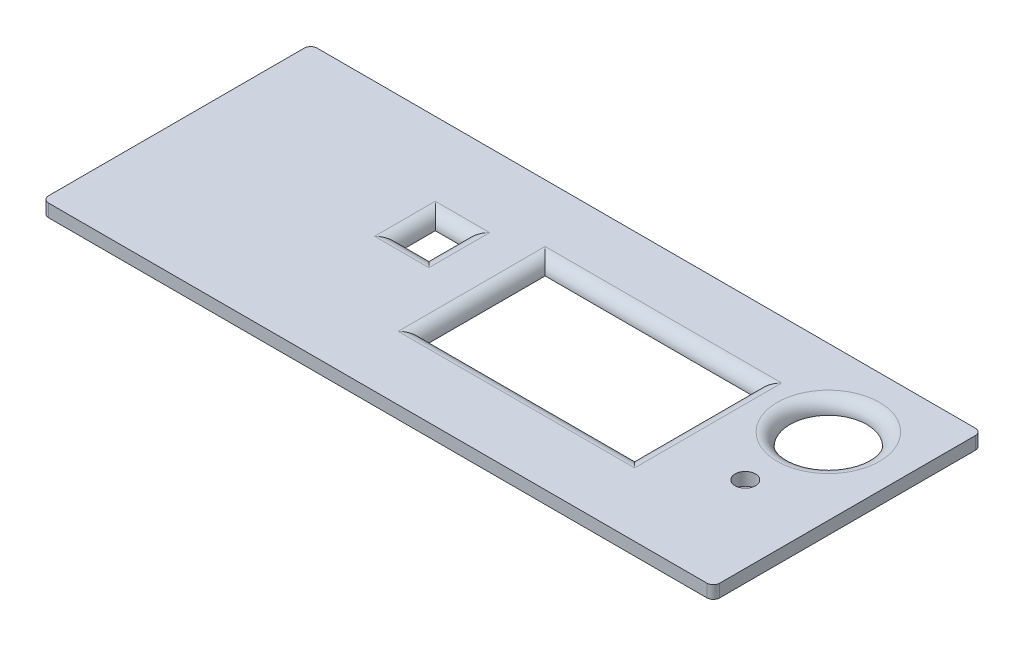
ISO-10303-21;
HEADER;
FILE_DESCRIPTION(('STEP AP214'),'2;1');
FILE_NAME('part.step','',(''),(''),'','','');
FILE_SCHEMA(('AUTOMOTIVE_DESIGN { 1 0 10303 214 1 1 1 1 }'));
ENDSEC;
DATA;
#1=APPLICATION_CONTEXT('core data for automotive mechanical design processes');
#2=APPLICATION_PROTOCOL_DEFINITION('international standard','automotive_design',2000,#1);
#3=PRODUCT_CONTEXT('',#1,'mechanical');
#4=PRODUCT('Part','Part','',(#3));
#5=PRODUCT_RELATED_PRODUCT_CATEGORY('part','',(#4));
#6=PRODUCT_DEFINITION_FORMATION('','',#4);
#7=PRODUCT_DEFINITION_CONTEXT('part definition',#1,'design');
#8=PRODUCT_DEFINITION('design','',#6,#7);
#9=PRODUCT_DEFINITION_SHAPE('','',#8);
#10=(LENGTH_UNIT() NAMED_UNIT(*) SI_UNIT(.MILLI.,.METRE.));
#11=(NAMED_UNIT(*) PLANE_ANGLE_UNIT() SI_UNIT($,.RADIAN.));
#12=(NAMED_UNIT(*) SI_UNIT($,.STERADIAN.) SOLID_ANGLE_UNIT());
#13=UNCERTAINTY_MEASURE_WITH_UNIT(LENGTH_MEASURE(1.E-05),#10,'distance_accuracy_value','');
#14=(GEOMETRIC_REPRESENTATION_CONTEXT(3) GLOBAL_UNCERTAINTY_ASSIGNED_CONTEXT((#13)) GLOBAL_UNIT_ASSIGNED_CONTEXT((#10,
#11,#12)) REPRESENTATION_CONTEXT('',''));
#15=CARTESIAN_POINT('',(0.,0.,0.));
#16=DIRECTION('',(0.,0.,1.));
#17=DIRECTION('',(1.,0.,0.));
#18=AXIS2_PLACEMENT_3D('',#15,#16,#17);
#19=CARTESIAN_POINT('',(52.5,-76.5109731551823,0.5));
#20=DIRECTION('',(1.,0.,0.));
#21=DIRECTION('',(0.,0.,-1.));
#22=AXIS2_PLACEMENT_3D('',#19,#20,#21);
#23=PLANE('',#22);
#24=DIRECTION('',(0.,0.,1.));
#25=VECTOR('',#24,1.);
#26=CARTESIAN_POINT('',(52.5,-76.5109731551823,0.5));
#27=LINE('',#26,#25);
#28=CARTESIAN_POINT('',(52.5,-76.5109731551823,1.5));
#29=VERTEX_POINT('',#28);
#30=CARTESIAN_POINT('',(52.5,-76.5109731551823,41.5));
#31=VERTEX_POINT('',#30);
#32=EDGE_CURVE('E253',#29,#31,#27,.T.);
#33=ORIENTED_EDGE('',*,*,#32,.T.);
#34=DIRECTION('',(0.,-1.,0.));
#35=VECTOR('',#34,1.);
#36=CARTESIAN_POINT('',(52.5,-76.5109731551823,41.5));
#37=LINE('',#36,#35);
#38=CARTESIAN_POINT('',(52.5,-78.5109731551823,41.5));
#39=VERTEX_POINT('',#38);
#40=EDGE_CURVE('E213',#31,#39,#37,.T.);
#41=ORIENTED_EDGE('',*,*,#40,.T.);
#42=DIRECTION('',(0.,0.,1.));
#43=VECTOR('',#42,1.);
#44=CARTESIAN_POINT('',(52.5,-78.5109731551823,0.5));
#45=LINE('',#44,#43);
#46=CARTESIAN_POINT('',(52.5,-78.5109731551823,1.5));
#47=VERTEX_POINT('',#46);
#48=EDGE_CURVE('E260',#47,#39,#45,.T.);
#49=ORIENTED_EDGE('',*,*,#48,.F.);
#50=DIRECTION('',(0.,-1.,0.));
#51=VECTOR('',#50,1.);
#52=CARTESIAN_POINT('',(52.5,-76.5109731551823,1.5));
#53=LINE('',#52,#51);
#54=EDGE_CURVE('E216',#47,#29,#53,.F.);
#55=ORIENTED_EDGE('',*,*,#54,.T.);
#56=EDGE_LOOP('',(#33,#41,#49,#55));
#57=FACE_BOUND('',#56,.T.);
#58=ADVANCED_FACE('F37',(#57),#23,.T.);
#59=CARTESIAN_POINT('',(-52.5,-76.5109731551823,0.5));
#60=DIRECTION('',(0.,0.,-1.));
#61=DIRECTION('',(-1.,0.,0.));
#62=AXIS2_PLACEMENT_3D('',#59,#60,#61);
#63=PLANE('',#62);
#64=DIRECTION('',(1.,0.,0.));
#65=VECTOR('',#64,1.);
#66=CARTESIAN_POINT('',(-52.5,-78.5109731551823,0.5));
#67=LINE('',#66,#65);
#68=CARTESIAN_POINT('',(-51.5,-78.5109731551823,0.5));
#69=VERTEX_POINT('',#68);
#70=CARTESIAN_POINT('',(51.5,-78.5109731551823,0.5));
#71=VERTEX_POINT('',#70);
#72=EDGE_CURVE('E250',#69,#71,#67,.T.);
#73=ORIENTED_EDGE('',*,*,#72,.F.);
#74=DIRECTION('',(0.,-1.,0.));
#75=VECTOR('',#74,1.);
#76=CARTESIAN_POINT('',(-51.5,-76.5109731551823,0.5));
#77=LINE('',#76,#75);
#78=CARTESIAN_POINT('',(-51.5,-76.5109731551823,0.5));
#79=VERTEX_POINT('',#78);
#80=EDGE_CURVE('E231',#69,#79,#77,.F.);
#81=ORIENTED_EDGE('',*,*,#80,.T.);
#82=DIRECTION('',(1.,0.,0.));
#83=VECTOR('',#82,1.);
#84=CARTESIAN_POINT('',(-52.5,-76.5109731551823,0.5));
#85=LINE('',#84,#83);
#86=CARTESIAN_POINT('',(51.5,-76.5109731551823,0.5));
#87=VERTEX_POINT('',#86);
#88=EDGE_CURVE('E249',#79,#87,#85,.T.);
#89=ORIENTED_EDGE('',*,*,#88,.T.);
#90=DIRECTION('',(0.,-1.,0.));
#91=VECTOR('',#90,1.);
#92=CARTESIAN_POINT('',(51.5,-76.5109731551823,0.5));
#93=LINE('',#92,#91);
#94=EDGE_CURVE('E233',#87,#71,#93,.T.);
#95=ORIENTED_EDGE('',*,*,#94,.T.);
#96=EDGE_LOOP('',(#73,#81,#89,#95));
#97=FACE_BOUND('',#96,.T.);
#98=ADVANCED_FACE('F340',(#97),#63,.T.);
#99=CARTESIAN_POINT('',(-52.5,-76.5109731551823,42.5));
#100=DIRECTION('',(-1.,0.,0.));
#101=DIRECTION('',(0.,0.,1.));
#102=AXIS2_PLACEMENT_3D('',#99,#100,#101);
#103=PLANE('',#102);
#104=DIRECTION('',(0.,0.,-1.));
#105=VECTOR('',#104,1.);
#106=CARTESIAN_POINT('',(-52.5,-76.5109731551823,42.5));
#107=LINE('',#106,#105);
#108=CARTESIAN_POINT('',(-52.5,-76.5109731551823,41.5));
#109=VERTEX_POINT('',#108);
#110=CARTESIAN_POINT('',(-52.5,-76.5109731551823,1.5));
#111=VERTEX_POINT('',#110);
#112=EDGE_CURVE('E266',#109,#111,#107,.T.);
#113=ORIENTED_EDGE('',*,*,#112,.T.);
#114=DIRECTION('',(0.,-1.,0.));
#115=VECTOR('',#114,1.);
#116=CARTESIAN_POINT('',(-52.5,-76.5109731551823,1.5));
#117=LINE('',#116,#115);
#118=CARTESIAN_POINT('',(-52.5,-78.5109731551823,1.5));
#119=VERTEX_POINT('',#118);
#120=EDGE_CURVE('E244',#111,#119,#117,.T.);
#121=ORIENTED_EDGE('',*,*,#120,.T.);
#122=DIRECTION('',(0.,0.,-1.));
#123=VECTOR('',#122,1.);
#124=CARTESIAN_POINT('',(-52.5,-78.5109731551823,42.5));
#125=LINE('',#124,#123);
#126=CARTESIAN_POINT('',(-52.5,-78.5109731551823,41.5));
#127=VERTEX_POINT('',#126);
#128=EDGE_CURVE('E254',#127,#119,#125,.T.);
#129=ORIENTED_EDGE('',*,*,#128,.F.);
#130=DIRECTION('',(0.,-1.,0.));
#131=VECTOR('',#130,1.);
#132=CARTESIAN_POINT('',(-52.5,-76.5109731551823,41.5));
#133=LINE('',#132,#131);
#134=EDGE_CURVE('E247',#127,#109,#133,.F.);
#135=ORIENTED_EDGE('',*,*,#134,.T.);
#136=EDGE_LOOP('',(#113,#121,#129,#135));
#137=FACE_BOUND('',#136,.T.);
#138=ADVANCED_FACE('F319',(#137),#103,.T.);
#139=CARTESIAN_POINT('',(52.5,-76.5109731551823,42.5));
#140=DIRECTION('',(0.,0.,1.));
#141=DIRECTION('',(1.,0.,0.));
#142=AXIS2_PLACEMENT_3D('',#139,#140,#141);
#143=PLANE('',#142);
#144=DIRECTION('',(-1.,0.,0.));
#145=VECTOR('',#144,1.);
#146=CARTESIAN_POINT('',(52.5,-76.5109731551823,42.5));
#147=LINE('',#146,#145);
#148=CARTESIAN_POINT('',(51.5,-76.5109731551823,42.5));
#149=VERTEX_POINT('',#148);
#150=CARTESIAN_POINT('',(-51.5,-76.5109731551823,42.5));
#151=VERTEX_POINT('',#150);
#152=EDGE_CURVE('E269',#149,#151,#147,.T.);
#153=ORIENTED_EDGE('',*,*,#152,.T.);
#154=DIRECTION('',(0.,-1.,0.));
#155=VECTOR('',#154,1.);
#156=CARTESIAN_POINT('',(-51.5,-76.5109731551823,42.5));
#157=LINE('',#156,#155);
#158=CARTESIAN_POINT('',(-51.5,-78.5109731551823,42.5));
#159=VERTEX_POINT('',#158);
#160=EDGE_CURVE('E218',#151,#159,#157,.T.);
#161=ORIENTED_EDGE('',*,*,#160,.T.);
#162=DIRECTION('',(-1.,0.,0.));
#163=VECTOR('',#162,1.);
#164=CARTESIAN_POINT('',(52.5,-78.5109731551823,42.5));
#165=LINE('',#164,#163);
#166=CARTESIAN_POINT('',(51.5,-78.5109731551823,42.5));
#167=VERTEX_POINT('',#166);
#168=EDGE_CURVE('E257',#167,#159,#165,.T.);
#169=ORIENTED_EDGE('',*,*,#168,.F.);
#170=DIRECTION('',(0.,-1.,0.));
#171=VECTOR('',#170,1.);
#172=CARTESIAN_POINT('',(51.5,-76.5109731551823,42.5));
#173=LINE('',#172,#171);
#174=EDGE_CURVE('E221',#167,#149,#173,.F.);
#175=ORIENTED_EDGE('',*,*,#174,.T.);
#176=EDGE_LOOP('',(#153,#161,#169,#175));
#177=FACE_BOUND('',#176,.T.);
#178=ADVANCED_FACE('F298',(#177),#143,.T.);
#179=CARTESIAN_POINT('',(0.,-76.5109731551823,0.));
#180=DIRECTION('',(0.,-1.,0.));
#181=DIRECTION('',(0.,0.,-1.));
#182=AXIS2_PLACEMENT_3D('',#179,#180,#181);
#183=PLANE('',#182);
#184=DIRECTION('',(0.,0.,-1.));
#185=VECTOR('',#184,1.);
#186=CARTESIAN_POINT('',(-21.5,-76.5109731551823,0.));
#187=LINE('',#186,#185);
#188=CARTESIAN_POINT('',(-21.5,-76.5109731551823,21.5));
#189=VERTEX_POINT('',#188);
#190=CARTESIAN_POINT('',(-21.5,-76.5109731551823,12.));
#191=VERTEX_POINT('',#190);
#192=EDGE_CURVE('E174',#189,#191,#187,.T.);
#193=ORIENTED_EDGE('',*,*,#192,.T.);
#194=DIRECTION('',(1.,0.,0.));
#195=VECTOR('',#194,1.);
#196=CARTESIAN_POINT('',(0.,-76.5109731551823,12.));
#197=LINE('',#196,#195);
#198=CARTESIAN_POINT('',(-13.,-76.5109731551823,12.));
#199=VERTEX_POINT('',#198);
#200=EDGE_CURVE('E11',#191,#199,#197,.T.);
#201=ORIENTED_EDGE('',*,*,#200,.T.);
#202=DIRECTION('',(0.,0.,1.));
#203=VECTOR('',#202,1.);
#204=CARTESIAN_POINT('',(-13.,-76.5109731551823,0.));
#205=LINE('',#204,#203);
#206=CARTESIAN_POINT('',(-13.,-76.5109731551823,21.5));
#207=VERTEX_POINT('',#206);
#208=EDGE_CURVE('E46',#199,#207,#205,.T.);
#209=ORIENTED_EDGE('',*,*,#208,.T.);
#210=DIRECTION('',(-1.,0.,0.));
#211=VECTOR('',#210,1.);
#212=CARTESIAN_POINT('',(0.,-76.5109731551823,21.5));
#213=LINE('',#212,#211);
#214=EDGE_CURVE('E198',#207,#189,#213,.T.);
#215=ORIENTED_EDGE('',*,*,#214,.T.);
#216=EDGE_LOOP('',(#193,#201,#209,#215));
#217=FACE_BOUND('',#216,.T.);
#218=DIRECTION('',(1.,0.,0.));
#219=VECTOR('',#218,1.);
#220=CARTESIAN_POINT('',(0.,-76.5109731551823,9.53676494240931));
#221=LINE('',#220,#219);
#222=CARTESIAN_POINT('',(-6.77586233036589,-76.5109731551823,9.53676494240931));
#223=VERTEX_POINT('',#222);
#224=CARTESIAN_POINT('',(30.2241376696341,-76.5109731551823,9.53676494240931));
#225=VERTEX_POINT('',#224);
#226=EDGE_CURVE('E208',#223,#225,#221,.T.);
#227=ORIENTED_EDGE('',*,*,#226,.T.);
#228=DIRECTION('',(0.,0.,1.));
#229=VECTOR('',#228,1.);
#230=CARTESIAN_POINT('',(30.2241376696341,-76.5109731551823,0.));
#231=LINE('',#230,#229);
#232=CARTESIAN_POINT('',(30.2241376696341,-76.5109731551823,32.5367649424093));
#233=VERTEX_POINT('',#232);
#234=EDGE_CURVE('E201',#225,#233,#231,.T.);
#235=ORIENTED_EDGE('',*,*,#234,.T.);
#236=DIRECTION('',(-1.,0.,0.));
#237=VECTOR('',#236,1.);
#238=CARTESIAN_POINT('',(0.,-76.5109731551823,32.5367649424093));
#239=LINE('',#238,#237);
#240=CARTESIAN_POINT('',(-6.77586233036589,-76.5109731551823,32.5367649424093));
#241=VERTEX_POINT('',#240);
#242=EDGE_CURVE('E204',#233,#241,#239,.T.);
#243=ORIENTED_EDGE('',*,*,#242,.T.);
#244=DIRECTION('',(0.,0.,-1.));
#245=VECTOR('',#244,1.);
#246=CARTESIAN_POINT('',(-6.77586233036589,-76.5109731551823,0.));
#247=LINE('',#246,#245);
#248=EDGE_CURVE('E206',#241,#223,#247,.T.);
#249=ORIENTED_EDGE('',*,*,#248,.T.);
#250=EDGE_LOOP('',(#227,#235,#243,#249));
#251=FACE_BOUND('',#250,.T.);
#252=CARTESIAN_POINT('',(40.5,-76.5109731551823,12.5));
#253=DIRECTION('',(0.,-1.,0.));
#254=DIRECTION('',(0.,0.,-1.));
#255=AXIS2_PLACEMENT_3D('',#252,#253,#254);
#256=CIRCLE('',#255,8.);
#257=CARTESIAN_POINT('',(40.5,-76.5109731551823,4.50000000000001));
#258=VERTEX_POINT('',#257);
#259=EDGE_CURVE('E210',#258,#258,#256,.T.);
#260=ORIENTED_EDGE('',*,*,#259,.T.);
#261=EDGE_LOOP('',(#260));
#262=FACE_BOUND('',#261,.T.);
#263=CARTESIAN_POINT('',(40.5,-76.5109731551823,25.5));
#264=DIRECTION('',(0.,-1.,0.));
#265=DIRECTION('',(0.,0.,-1.));
#266=AXIS2_PLACEMENT_3D('',#263,#264,#265);
#267=CIRCLE('',#266,1.6);
#268=CARTESIAN_POINT('',(40.5,-76.5109731551823,23.9));
#269=VERTEX_POINT('',#268);
#270=EDGE_CURVE('E276',#269,#269,#267,.T.);
#271=ORIENTED_EDGE('',*,*,#270,.T.);
#272=EDGE_LOOP('',(#271));
#273=FACE_BOUND('',#272,.T.);
#274=ORIENTED_EDGE('',*,*,#88,.F.);
#275=CARTESIAN_POINT('',(-51.5,-76.5109731551823,1.5));
#276=DIRECTION('',(0.,-1.,0.));
#277=DIRECTION('',(0.,0.,-1.));
#278=AXIS2_PLACEMENT_3D('',#275,#276,#277);
#279=CIRCLE('',#278,1.);
#280=EDGE_CURVE('E223',#79,#111,#279,.F.);
#281=ORIENTED_EDGE('',*,*,#280,.T.);
#282=ORIENTED_EDGE('',*,*,#112,.F.);
#283=CARTESIAN_POINT('',(-51.5,-76.5109731551823,41.5));
#284=DIRECTION('',(0.,-1.,0.));
#285=DIRECTION('',(0.,0.,-1.));
#286=AXIS2_PLACEMENT_3D('',#283,#284,#285);
#287=CIRCLE('',#286,1.);
#288=EDGE_CURVE('E225',#109,#151,#287,.F.);
#289=ORIENTED_EDGE('',*,*,#288,.T.);
#290=ORIENTED_EDGE('',*,*,#152,.F.);
#291=CARTESIAN_POINT('',(51.5,-76.5109731551823,41.5));
#292=DIRECTION('',(0.,-1.,0.));
#293=DIRECTION('',(0.,0.,-1.));
#294=AXIS2_PLACEMENT_3D('',#291,#292,#293);
#295=CIRCLE('',#294,1.);
#296=EDGE_CURVE('E227',#149,#31,#295,.F.);
#297=ORIENTED_EDGE('',*,*,#296,.T.);
#298=ORIENTED_EDGE('',*,*,#32,.F.);
#299=CARTESIAN_POINT('',(51.5,-76.5109731551823,1.5));
#300=DIRECTION('',(0.,-1.,0.));
#301=DIRECTION('',(0.,0.,-1.));
#302=AXIS2_PLACEMENT_3D('',#299,#300,#301);
#303=CIRCLE('',#302,1.);
#304=EDGE_CURVE('E229',#29,#87,#303,.F.);
#305=ORIENTED_EDGE('',*,*,#304,.T.);
#306=EDGE_LOOP('',(#274,#281,#282,#289,#290,#297,#298,#305));
#307=FACE_BOUND('',#306,.T.);
#308=ADVANCED_FACE('F295',(#217,#251,#262,#273,#307),#183,.F.);
#309=CARTESIAN_POINT('',(0.,-78.5109731551823,0.));
#310=DIRECTION('',(0.,-1.,0.));
#311=DIRECTION('',(0.,0.,-1.));
#312=AXIS2_PLACEMENT_3D('',#309,#310,#311);
#313=PLANE('',#312);
#314=DIRECTION('',(0.,0.,1.));
#315=VECTOR('',#314,1.);
#316=CARTESIAN_POINT('',(-15.,-78.5109731551823,14.));
#317=LINE('',#316,#315);
#318=CARTESIAN_POINT('',(-15.,-78.5109731551823,14.));
#319=VERTEX_POINT('',#318);
#320=CARTESIAN_POINT('',(-15.,-78.5109731551823,19.5));
#321=VERTEX_POINT('',#320);
#322=EDGE_CURVE('E171',#319,#321,#317,.T.);
#323=ORIENTED_EDGE('',*,*,#322,.F.);
#324=DIRECTION('',(1.,0.,0.));
#325=VECTOR('',#324,1.);
#326=CARTESIAN_POINT('',(-15.,-78.5109731551823,14.));
#327=LINE('',#326,#325);
#328=CARTESIAN_POINT('',(-19.5,-78.5109731551823,14.));
#329=VERTEX_POINT('',#328);
#330=EDGE_CURVE('E158',#329,#319,#327,.T.);
#331=ORIENTED_EDGE('',*,*,#330,.F.);
#332=DIRECTION('',(0.,0.,-1.));
#333=VECTOR('',#332,1.);
#334=CARTESIAN_POINT('',(-19.5,-78.5109731551823,14.));
#335=LINE('',#334,#333);
#336=CARTESIAN_POINT('',(-19.5,-78.5109731551823,19.5));
#337=VERTEX_POINT('',#336);
#338=EDGE_CURVE('E152',#337,#329,#335,.T.);
#339=ORIENTED_EDGE('',*,*,#338,.F.);
#340=DIRECTION('',(-1.,0.,0.));
#341=VECTOR('',#340,1.);
#342=CARTESIAN_POINT('',(-15.,-78.5109731551823,19.5));
#343=LINE('',#342,#341);
#344=EDGE_CURVE('E156',#321,#337,#343,.T.);
#345=ORIENTED_EDGE('',*,*,#344,.F.);
#346=EDGE_LOOP('',(#323,#331,#339,#345));
#347=FACE_BOUND('',#346,.T.);
#348=DIRECTION('',(0.,0.,1.));
#349=VECTOR('',#348,1.);
#350=CARTESIAN_POINT('',(28.2241376696341,-78.5109731551823,11.5367649424093));
#351=LINE('',#350,#349);
#352=CARTESIAN_POINT('',(28.2241376696341,-78.5109731551823,11.5367649424093));
#353=VERTEX_POINT('',#352);
#354=CARTESIAN_POINT('',(28.2241376696341,-78.5109731551823,30.5367649424093));
#355=VERTEX_POINT('',#354);
#356=EDGE_CURVE('E289',#353,#355,#351,.T.);
#357=ORIENTED_EDGE('',*,*,#356,.F.);
#358=DIRECTION('',(1.,0.,0.));
#359=VECTOR('',#358,1.);
#360=CARTESIAN_POINT('',(28.2241376696341,-78.5109731551823,11.5367649424093));
#361=LINE('',#360,#359);
#362=CARTESIAN_POINT('',(-4.77586233036589,-78.5109731551823,11.5367649424093));
#363=VERTEX_POINT('',#362);
#364=EDGE_CURVE('E280',#363,#353,#361,.T.);
#365=ORIENTED_EDGE('',*,*,#364,.F.);
#366=DIRECTION('',(0.,0.,-1.));
#367=VECTOR('',#366,1.);
#368=CARTESIAN_POINT('',(-4.77586233036589,-78.5109731551823,11.5367649424093));
#369=LINE('',#368,#367);
#370=CARTESIAN_POINT('',(-4.77586233036589,-78.5109731551823,30.5367649424093));
#371=VERTEX_POINT('',#370);
#372=EDGE_CURVE('E284',#371,#363,#369,.T.);
#373=ORIENTED_EDGE('',*,*,#372,.F.);
#374=DIRECTION('',(-1.,0.,0.));
#375=VECTOR('',#374,1.);
#376=CARTESIAN_POINT('',(28.2241376696341,-78.5109731551823,30.5367649424093));
#377=LINE('',#376,#375);
#378=EDGE_CURVE('E287',#355,#371,#377,.T.);
#379=ORIENTED_EDGE('',*,*,#378,.F.);
#380=EDGE_LOOP('',(#357,#365,#373,#379));
#381=FACE_BOUND('',#380,.T.);
#382=CARTESIAN_POINT('',(40.5,-78.5109731551823,25.5));
#383=DIRECTION('',(0.,-1.,0.));
#384=DIRECTION('',(0.,0.,-1.));
#385=AXIS2_PLACEMENT_3D('',#382,#383,#384);
#386=CIRCLE('',#385,1.6);
#387=CARTESIAN_POINT('',(40.5,-78.5109731551823,23.9));
#388=VERTEX_POINT('',#387);
#389=EDGE_CURVE('E277',#388,#388,#386,.T.);
#390=ORIENTED_EDGE('',*,*,#389,.F.);
#391=EDGE_LOOP('',(#390));
#392=FACE_BOUND('',#391,.T.);
#393=CARTESIAN_POINT('',(40.5,-78.5109731551823,12.5));
#394=DIRECTION('',(0.,-1.,0.));
#395=DIRECTION('',(0.,0.,-1.));
#396=AXIS2_PLACEMENT_3D('',#393,#394,#395);
#397=CIRCLE('',#396,6.);
#398=CARTESIAN_POINT('',(40.5,-78.5109731551823,6.50000000000002));
#399=VERTEX_POINT('',#398);
#400=EDGE_CURVE('E263',#399,#399,#397,.T.);
#401=ORIENTED_EDGE('',*,*,#400,.F.);
#402=EDGE_LOOP('',(#401));
#403=FACE_BOUND('',#402,.T.);
#404=ORIENTED_EDGE('',*,*,#128,.T.);
#405=CARTESIAN_POINT('',(-51.5,-78.5109731551823,1.5));
#406=DIRECTION('',(0.,-1.,0.));
#407=DIRECTION('',(0.,0.,-1.));
#408=AXIS2_PLACEMENT_3D('',#405,#406,#407);
#409=CIRCLE('',#408,1.);
#410=EDGE_CURVE('E236',#119,#69,#409,.T.);
#411=ORIENTED_EDGE('',*,*,#410,.T.);
#412=ORIENTED_EDGE('',*,*,#72,.T.);
#413=CARTESIAN_POINT('',(51.5,-78.5109731551823,1.5));
#414=DIRECTION('',(0.,-1.,0.));
#415=DIRECTION('',(0.,0.,-1.));
#416=AXIS2_PLACEMENT_3D('',#413,#414,#415);
#417=CIRCLE('',#416,1.);
#418=EDGE_CURVE('E242',#71,#47,#417,.T.);
#419=ORIENTED_EDGE('',*,*,#418,.T.);
#420=ORIENTED_EDGE('',*,*,#48,.T.);
#421=CARTESIAN_POINT('',(51.5,-78.5109731551823,41.5));
#422=DIRECTION('',(0.,-1.,0.));
#423=DIRECTION('',(0.,0.,-1.));
#424=AXIS2_PLACEMENT_3D('',#421,#422,#423);
#425=CIRCLE('',#424,1.);
#426=EDGE_CURVE('E240',#39,#167,#425,.T.);
#427=ORIENTED_EDGE('',*,*,#426,.T.);
#428=ORIENTED_EDGE('',*,*,#168,.T.);
#429=CARTESIAN_POINT('',(-51.5,-78.5109731551823,41.5));
#430=DIRECTION('',(0.,-1.,0.));
#431=DIRECTION('',(0.,0.,-1.));
#432=AXIS2_PLACEMENT_3D('',#429,#430,#431);
#433=CIRCLE('',#432,1.);
#434=EDGE_CURVE('E238',#159,#127,#433,.T.);
#435=ORIENTED_EDGE('',*,*,#434,.T.);
#436=EDGE_LOOP('',(#404,#411,#412,#419,#420,#427,#428,#435));
#437=FACE_BOUND('',#436,.T.);
#438=ADVANCED_FACE('F154',(#347,#381,#392,#403,#437),#313,.T.);
#439=CARTESIAN_POINT('',(40.5,-76.5109731551823,25.5));
#440=DIRECTION('',(0.,-1.,0.));
#441=DIRECTION('',(0.,0.,-1.));
#442=AXIS2_PLACEMENT_3D('',#439,#440,#441);
#443=CYLINDRICAL_SURFACE('',#442,1.6);
#444=ORIENTED_EDGE('',*,*,#270,.F.);
#445=EDGE_LOOP('',(#444));
#446=FACE_BOUND('',#445,.T.);
#447=ORIENTED_EDGE('',*,*,#389,.T.);
#448=EDGE_LOOP('',(#447));
#449=FACE_BOUND('',#448,.T.);
#450=ADVANCED_FACE('F355',(#446,#449),#443,.F.);
#451=CARTESIAN_POINT('',(-51.5,-76.5109731551823,1.5));
#452=DIRECTION('',(0.,-1.,0.));
#453=DIRECTION('',(0.,0.,-1.));
#454=AXIS2_PLACEMENT_3D('',#451,#452,#453);
#455=CYLINDRICAL_SURFACE('',#454,1.);
#456=ORIENTED_EDGE('',*,*,#280,.F.);
#457=ORIENTED_EDGE('',*,*,#80,.F.);
#458=ORIENTED_EDGE('',*,*,#410,.F.);
#459=ORIENTED_EDGE('',*,*,#120,.F.);
#460=EDGE_LOOP('',(#456,#457,#458,#459));
#461=FACE_BOUND('',#460,.T.);
#462=ADVANCED_FACE('F316',(#461),#455,.T.);
#463=CARTESIAN_POINT('',(-51.5,-76.5109731551823,41.5));
#464=DIRECTION('',(0.,-1.,0.));
#465=DIRECTION('',(0.,0.,-1.));
#466=AXIS2_PLACEMENT_3D('',#463,#464,#465);
#467=CYLINDRICAL_SURFACE('',#466,1.);
#468=ORIENTED_EDGE('',*,*,#288,.F.);
#469=ORIENTED_EDGE('',*,*,#134,.F.);
#470=ORIENTED_EDGE('',*,*,#434,.F.);
#471=ORIENTED_EDGE('',*,*,#160,.F.);
#472=EDGE_LOOP('',(#468,#469,#470,#471));
#473=FACE_BOUND('',#472,.T.);
#474=ADVANCED_FACE('F327',(#473),#467,.T.);
#475=CARTESIAN_POINT('',(51.5,-76.5109731551823,41.5));
#476=DIRECTION('',(0.,-1.,0.));
#477=DIRECTION('',(0.,0.,-1.));
#478=AXIS2_PLACEMENT_3D('',#475,#476,#477);
#479=CYLINDRICAL_SURFACE('',#478,1.);
#480=ORIENTED_EDGE('',*,*,#296,.F.);
#481=ORIENTED_EDGE('',*,*,#174,.F.);
#482=ORIENTED_EDGE('',*,*,#426,.F.);
#483=ORIENTED_EDGE('',*,*,#40,.F.);
#484=EDGE_LOOP('',(#480,#481,#482,#483));
#485=FACE_BOUND('',#484,.T.);
#486=ADVANCED_FACE('F334',(#485),#479,.T.);
#487=CARTESIAN_POINT('',(51.5,-76.5109731551823,1.5));
#488=DIRECTION('',(0.,-1.,0.));
#489=DIRECTION('',(0.,0.,-1.));
#490=AXIS2_PLACEMENT_3D('',#487,#488,#489);
#491=CYLINDRICAL_SURFACE('',#490,1.);
#492=ORIENTED_EDGE('',*,*,#304,.F.);
#493=ORIENTED_EDGE('',*,*,#54,.F.);
#494=ORIENTED_EDGE('',*,*,#418,.F.);
#495=ORIENTED_EDGE('',*,*,#94,.F.);
#496=EDGE_LOOP('',(#492,#493,#494,#495));
#497=FACE_BOUND('',#496,.T.);
#498=ADVANCED_FACE('F339',(#497),#491,.T.);
#499=CARTESIAN_POINT('',(0.,-78.5109731551823,21.5));
#500=DIRECTION('',(-1.,0.,0.));
#501=DIRECTION('',(0.,0.,1.));
#502=AXIS2_PLACEMENT_3D('',#499,#500,#501);
#503=CYLINDRICAL_SURFACE('',#502,2.);
#504=CARTESIAN_POINT('',(-13.,-78.5109731551823,21.5));
#505=DIRECTION('',(-0.707106781186548,0.,0.707106781186547));
#506=DIRECTION('',(0.707106781186547,0.,0.707106781186548));
#507=AXIS2_PLACEMENT_3D('',#504,#505,#506);
#508=ELLIPSE('',#507,2.82842712474619,2.);
#509=EDGE_CURVE('E169',#321,#207,#508,.F.);
#510=ORIENTED_EDGE('',*,*,#509,.F.);
#511=ORIENTED_EDGE('',*,*,#344,.T.);
#512=CARTESIAN_POINT('',(-21.5,-78.5109731551823,21.5));
#513=DIRECTION('',(-0.707106781186547,0.,-0.707106781186547));
#514=DIRECTION('',(-0.707106781186547,0.,0.707106781186547));
#515=AXIS2_PLACEMENT_3D('',#512,#513,#514);
#516=ELLIPSE('',#515,2.82842712474619,2.);
#517=EDGE_CURVE('E166',#189,#337,#516,.T.);
#518=ORIENTED_EDGE('',*,*,#517,.F.);
#519=ORIENTED_EDGE('',*,*,#214,.F.);
#520=EDGE_LOOP('',(#510,#511,#518,#519));
#521=FACE_BOUND('',#520,.T.);
#522=ADVANCED_FACE('F165',(#521),#503,.T.);
#523=CARTESIAN_POINT('',(-21.5,-78.5109731551823,0.));
#524=DIRECTION('',(0.,0.,-1.));
#525=DIRECTION('',(-1.,0.,0.));
#526=AXIS2_PLACEMENT_3D('',#523,#524,#525);
#527=CYLINDRICAL_SURFACE('',#526,2.);
#528=ORIENTED_EDGE('',*,*,#517,.T.);
#529=ORIENTED_EDGE('',*,*,#338,.T.);
#530=CARTESIAN_POINT('',(-21.5,-78.5109731551823,12.));
#531=DIRECTION('',(0.707106781186547,0.,-0.707106781186547));
#532=DIRECTION('',(0.707106781186547,0.,0.707106781186547));
#533=AXIS2_PLACEMENT_3D('',#530,#531,#532);
#534=ELLIPSE('',#533,2.82842712474619,2.);
#535=EDGE_CURVE('E177',#191,#329,#534,.T.);
#536=ORIENTED_EDGE('',*,*,#535,.F.);
#537=ORIENTED_EDGE('',*,*,#192,.F.);
#538=EDGE_LOOP('',(#528,#529,#536,#537));
#539=FACE_BOUND('',#538,.T.);
#540=ADVANCED_FACE('F173',(#539),#527,.T.);
#541=CARTESIAN_POINT('',(-13.,-78.5109731551823,0.));
#542=DIRECTION('',(0.,0.,1.));
#543=DIRECTION('',(1.,0.,0.));
#544=AXIS2_PLACEMENT_3D('',#541,#542,#543);
#545=CYLINDRICAL_SURFACE('',#544,2.);
#546=ORIENTED_EDGE('',*,*,#509,.T.);
#547=ORIENTED_EDGE('',*,*,#208,.F.);
#548=CARTESIAN_POINT('',(-13.,-78.5109731551823,12.));
#549=DIRECTION('',(0.707106781186547,0.,0.707106781186548));
#550=DIRECTION('',(0.707106781186548,0.,-0.707106781186547));
#551=AXIS2_PLACEMENT_3D('',#548,#549,#550);
#552=ELLIPSE('',#551,2.82842712474619,2.);
#553=EDGE_CURVE('E54',#319,#199,#552,.F.);
#554=ORIENTED_EDGE('',*,*,#553,.F.);
#555=ORIENTED_EDGE('',*,*,#322,.T.);
#556=EDGE_LOOP('',(#546,#547,#554,#555));
#557=FACE_BOUND('',#556,.T.);
#558=ADVANCED_FACE('F294',(#557),#545,.T.);
#559=CARTESIAN_POINT('',(0.,-78.5109731551823,12.));
#560=DIRECTION('',(1.,0.,0.));
#561=DIRECTION('',(0.,0.,-1.));
#562=AXIS2_PLACEMENT_3D('',#559,#560,#561);
#563=CYLINDRICAL_SURFACE('',#562,2.);
#564=ORIENTED_EDGE('',*,*,#535,.T.);
#565=ORIENTED_EDGE('',*,*,#330,.T.);
#566=ORIENTED_EDGE('',*,*,#553,.T.);
#567=ORIENTED_EDGE('',*,*,#200,.F.);
#568=EDGE_LOOP('',(#564,#565,#566,#567));
#569=FACE_BOUND('',#568,.T.);
#570=ADVANCED_FACE('F292',(#569),#563,.T.);
#571=CARTESIAN_POINT('',(-6.77586233036589,-78.5109731551823,0.));
#572=DIRECTION('',(0.,0.,-1.));
#573=DIRECTION('',(-1.,0.,0.));
#574=AXIS2_PLACEMENT_3D('',#571,#572,#573);
#575=CYLINDRICAL_SURFACE('',#574,2.);
#576=CARTESIAN_POINT('',(-6.77586233036589,-78.5109731551823,32.5367649424093));
#577=DIRECTION('',(-0.707106781186547,0.,-0.707106781186547));
#578=DIRECTION('',(-0.707106781186547,0.,0.707106781186547));
#579=AXIS2_PLACEMENT_3D('',#576,#577,#578);
#580=ELLIPSE('',#579,2.82842712474619,2.);
#581=EDGE_CURVE('E184',#371,#241,#580,.F.);
#582=ORIENTED_EDGE('',*,*,#581,.F.);
#583=ORIENTED_EDGE('',*,*,#372,.T.);
#584=CARTESIAN_POINT('',(-6.77586233036589,-78.5109731551823,9.53676494240931));
#585=DIRECTION('',(0.707106781186547,0.,-0.707106781186547));
#586=DIRECTION('',(-0.707106781186547,0.,-0.707106781186547));
#587=AXIS2_PLACEMENT_3D('',#584,#585,#586);
#588=ELLIPSE('',#587,2.82842712474619,2.);
#589=EDGE_CURVE('E41',#223,#363,#588,.T.);
#590=ORIENTED_EDGE('',*,*,#589,.F.);
#591=ORIENTED_EDGE('',*,*,#248,.F.);
#592=EDGE_LOOP('',(#582,#583,#590,#591));
#593=FACE_BOUND('',#592,.T.);
#594=ADVANCED_FACE('F364',(#593),#575,.T.);
#595=CARTESIAN_POINT('',(0.,-78.5109731551823,9.53676494240931));
#596=DIRECTION('',(1.,0.,0.));
#597=DIRECTION('',(0.,0.,-1.));
#598=AXIS2_PLACEMENT_3D('',#595,#596,#597);
#599=CYLINDRICAL_SURFACE('',#598,2.);
#600=ORIENTED_EDGE('',*,*,#589,.T.);
#601=ORIENTED_EDGE('',*,*,#364,.T.);
#602=CARTESIAN_POINT('',(30.2241376696341,-78.5109731551823,9.53676494240931));
#603=DIRECTION('',(0.707106781186547,0.,0.707106781186548));
#604=DIRECTION('',(-0.707106781186548,0.,0.707106781186547));
#605=AXIS2_PLACEMENT_3D('',#602,#603,#604);
#606=ELLIPSE('',#605,2.82842712474619,2.);
#607=EDGE_CURVE('E183',#225,#353,#606,.T.);
#608=ORIENTED_EDGE('',*,*,#607,.F.);
#609=ORIENTED_EDGE('',*,*,#226,.F.);
#610=EDGE_LOOP('',(#600,#601,#608,#609));
#611=FACE_BOUND('',#610,.T.);
#612=ADVANCED_FACE('F378',(#611),#599,.T.);
#613=CARTESIAN_POINT('',(0.,-78.5109731551823,32.5367649424093));
#614=DIRECTION('',(-1.,0.,0.));
#615=DIRECTION('',(0.,0.,1.));
#616=AXIS2_PLACEMENT_3D('',#613,#614,#615);
#617=CYLINDRICAL_SURFACE('',#616,2.);
#618=ORIENTED_EDGE('',*,*,#581,.T.);
#619=ORIENTED_EDGE('',*,*,#242,.F.);
#620=CARTESIAN_POINT('',(30.2241376696341,-78.5109731551823,32.5367649424093));
#621=DIRECTION('',(-0.707106781186548,0.,0.707106781186547));
#622=DIRECTION('',(0.707106781186547,0.,0.707106781186548));
#623=AXIS2_PLACEMENT_3D('',#620,#621,#622);
#624=ELLIPSE('',#623,2.82842712474619,2.);
#625=EDGE_CURVE('E181',#355,#233,#624,.F.);
#626=ORIENTED_EDGE('',*,*,#625,.F.);
#627=ORIENTED_EDGE('',*,*,#378,.T.);
#628=EDGE_LOOP('',(#618,#619,#626,#627));
#629=FACE_BOUND('',#628,.T.);
#630=ADVANCED_FACE('F374',(#629),#617,.T.);
#631=CARTESIAN_POINT('',(30.2241376696341,-78.5109731551823,0.));
#632=DIRECTION('',(0.,0.,1.));
#633=DIRECTION('',(1.,0.,0.));
#634=AXIS2_PLACEMENT_3D('',#631,#632,#633);
#635=CYLINDRICAL_SURFACE('',#634,2.);
#636=ORIENTED_EDGE('',*,*,#607,.T.);
#637=ORIENTED_EDGE('',*,*,#356,.T.);
#638=ORIENTED_EDGE('',*,*,#625,.T.);
#639=ORIENTED_EDGE('',*,*,#234,.F.);
#640=EDGE_LOOP('',(#636,#637,#638,#639));
#641=FACE_BOUND('',#640,.T.);
#642=ADVANCED_FACE('F371',(#641),#635,.T.);
#643=CARTESIAN_POINT('',(40.5,-78.5109731551823,12.5));
#644=DIRECTION('',(0.,-1.,0.));
#645=DIRECTION('',(0.,0.,-1.));
#646=AXIS2_PLACEMENT_3D('',#643,#644,#645);
#647=TOROIDAL_SURFACE('',#646,8.,2.);
#648=ORIENTED_EDGE('',*,*,#400,.T.);
#649=EDGE_LOOP('',(#648));
#650=FACE_BOUND('',#649,.T.);
#651=ORIENTED_EDGE('',*,*,#259,.F.);
#652=EDGE_LOOP('',(#651));
#653=FACE_BOUND('',#652,.T.);
#654=ADVANCED_FACE('F39',(#650,#653),#647,.T.);
#655=CLOSED_SHELL('',(#58,#98,#138,#178,#308,#438,#450,#462,#474,#486,#498,#522,#540,#558,#570,
#594,#612,#630,#642,#654));
#656=MANIFOLD_SOLID_BREP('B2',#655);
#657=ADVANCED_BREP_SHAPE_REPRESENTATION('',(#18,#656),#14);
#658=SHAPE_DEFINITION_REPRESENTATION(#9,#657);
ENDSEC;
END-ISO-10303-21;
